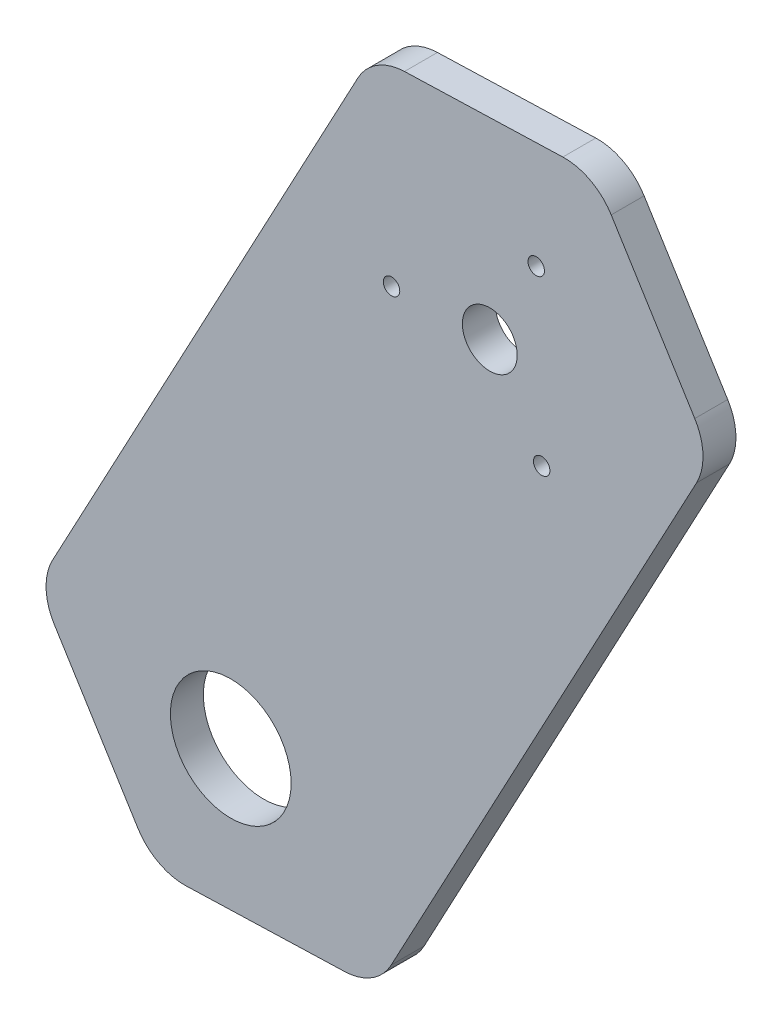
ISO-10303-21;
HEADER;
FILE_DESCRIPTION(('STEP AP214'),'2;1');
FILE_NAME('part.step','',(''),(''),'','','');
FILE_SCHEMA(('AUTOMOTIVE_DESIGN { 1 0 10303 214 1 1 1 1 }'));
ENDSEC;
DATA;
#1=APPLICATION_CONTEXT('core data for automotive mechanical design processes');
#2=APPLICATION_PROTOCOL_DEFINITION('international standard','automotive_design',2000,#1);
#3=PRODUCT_CONTEXT('',#1,'mechanical');
#4=PRODUCT('Part','Part','',(#3));
#5=PRODUCT_RELATED_PRODUCT_CATEGORY('part','',(#4));
#6=PRODUCT_DEFINITION_FORMATION('','',#4);
#7=PRODUCT_DEFINITION_CONTEXT('part definition',#1,'design');
#8=PRODUCT_DEFINITION('design','',#6,#7);
#9=PRODUCT_DEFINITION_SHAPE('','',#8);
#10=(LENGTH_UNIT() NAMED_UNIT(*) SI_UNIT(.MILLI.,.METRE.));
#11=(NAMED_UNIT(*) PLANE_ANGLE_UNIT() SI_UNIT($,.RADIAN.));
#12=(NAMED_UNIT(*) SI_UNIT($,.STERADIAN.) SOLID_ANGLE_UNIT());
#13=UNCERTAINTY_MEASURE_WITH_UNIT(LENGTH_MEASURE(1.E-05),#10,'distance_accuracy_value','');
#14=(GEOMETRIC_REPRESENTATION_CONTEXT(3) GLOBAL_UNCERTAINTY_ASSIGNED_CONTEXT((#13)) GLOBAL_UNIT_ASSIGNED_CONTEXT((#10,
#11,#12)) REPRESENTATION_CONTEXT('',''));
#15=CARTESIAN_POINT('',(0.,0.,0.));
#16=DIRECTION('',(0.,0.,1.));
#17=DIRECTION('',(1.,0.,0.));
#18=AXIS2_PLACEMENT_3D('',#15,#16,#17);
#19=CARTESIAN_POINT('',(-22.5555482322881,278.786500537117,6.));
#20=DIRECTION('',(0.,0.,1.));
#21=DIRECTION('',(1.,0.,0.));
#22=AXIS2_PLACEMENT_3D('',#19,#20,#21);
#23=PLANE('',#22);
#24=CARTESIAN_POINT('',(48.3080319671875,358.170976554401,6.));
#25=DIRECTION('',(0.,0.,1.));
#26=DIRECTION('',(1.,0.,0.));
#27=AXIS2_PLACEMENT_3D('',#24,#25,#26);
#28=CIRCLE('',#27,4.99999999999982);
#29=CARTESIAN_POINT('',(53.3080319671873,358.170976554401,6.));
#30=VERTEX_POINT('',#29);
#31=EDGE_CURVE('E303',#30,#30,#28,.T.);
#32=ORIENTED_EDGE('',*,*,#31,.F.);
#33=EDGE_LOOP('',(#32));
#34=FACE_BOUND('',#33,.T.);
#35=CARTESIAN_POINT('',(57.7585097588791,342.948926532382,6.));
#36=DIRECTION('',(0.,0.,1.));
#37=DIRECTION('',(1.,0.,0.));
#38=AXIS2_PLACEMENT_3D('',#35,#36,#37);
#39=CIRCLE('',#38,1.50000000001931);
#40=CARTESIAN_POINT('',(59.2585097588984,342.948926532382,6.));
#41=VERTEX_POINT('',#40);
#42=EDGE_CURVE('E315',#41,#41,#39,.T.);
#43=ORIENTED_EDGE('',*,*,#42,.F.);
#44=EDGE_LOOP('',(#43));
#45=FACE_BOUND('',#44,.T.);
#46=CARTESIAN_POINT('',(-22.5555482322881,278.786500537117,6.));
#47=DIRECTION('',(0.,0.,1.));
#48=DIRECTION('',(1.,0.,0.));
#49=AXIS2_PLACEMENT_3D('',#46,#47,#48);
#50=CIRCLE('',#49,10.0000000000106);
#51=CARTESIAN_POINT('',(-31.3713622752377,283.50682073392,6.));
#52=VERTEX_POINT('',#51);
#53=CARTESIAN_POINT('',(-31.0513724581903,273.511941719284,6.));
#54=VERTEX_POINT('',#53);
#55=EDGE_CURVE('E185',#52,#54,#50,.T.);
#56=ORIENTED_EDGE('',*,*,#55,.T.);
#57=DIRECTION('',(0.5274558817828,-0.849582422589314,0.));
#58=VECTOR('',#57,1.);
#59=CARTESIAN_POINT('',(-15.8250326915421,248.986609700247,6.));
#60=LINE('',#59,#58);
#61=CARTESIAN_POINT('',(-15.8250326915421,248.986609700247,6.));
#62=VERTEX_POINT('',#61);
#63=EDGE_CURVE('E113',#54,#62,#60,.T.);
#64=ORIENTED_EDGE('',*,*,#63,.T.);
#65=CARTESIAN_POINT('',(-7.32920846566501,254.261168518065,6.));
#66=DIRECTION('',(0.,0.,1.));
#67=DIRECTION('',(1.,0.,0.));
#68=AXIS2_PLACEMENT_3D('',#65,#66,#67);
#69=CIRCLE('',#68,9.99999999998109);
#70=CARTESIAN_POINT('',(-7.00921864860938,244.266289503459,6.));
#71=VERTEX_POINT('',#70);
#72=EDGE_CURVE('E212',#62,#71,#69,.T.);
#73=ORIENTED_EDGE('',*,*,#72,.T.);
#74=DIRECTION('',(0.999487901462477,0.0319989817046271,0.));
#75=VECTOR('',#74,1.);
#76=CARTESIAN_POINT('',(21.8435117994487,245.190020538507,6.));
#77=LINE('',#76,#75);
#78=CARTESIAN_POINT('',(21.8435117994487,245.190020538507,6.));
#79=VERTEX_POINT('',#78);
#80=EDGE_CURVE('E231',#71,#79,#77,.T.);
#81=ORIENTED_EDGE('',*,*,#80,.T.);
#82=CARTESIAN_POINT('',(21.5235219824024,255.184899553132,6.));
#83=DIRECTION('',(0.,0.,1.));
#84=DIRECTION('',(1.,0.,0.));
#85=AXIS2_PLACEMENT_3D('',#82,#83,#84);
#86=CIRCLE('',#85,9.99999999999995);
#87=CARTESIAN_POINT('',(30.3393360253425,250.464579356334,6.));
#88=VERTEX_POINT('',#87);
#89=EDGE_CURVE('E228',#79,#88,#86,.T.);
#90=ORIENTED_EDGE('',*,*,#89,.T.);
#91=DIRECTION('',(0.472032019679815,0.881581404294008,0.));
#92=VECTOR('',#91,1.);
#93=CARTESIAN_POINT('',(85.9765764582599,354.374387392588,6.));
#94=LINE('',#93,#92);
#95=CARTESIAN_POINT('',(85.9765764582599,354.374387392588,6.));
#96=VERTEX_POINT('',#95);
#97=EDGE_CURVE('E230',#88,#96,#94,.T.);
#98=ORIENTED_EDGE('',*,*,#97,.T.);
#99=CARTESIAN_POINT('',(77.1607624153199,359.094707589386,6.));
#100=DIRECTION('',(0.,0.,1.));
#101=DIRECTION('',(1.,0.,0.));
#102=AXIS2_PLACEMENT_3D('',#99,#100,#101);
#103=CIRCLE('',#102,9.99999999999997);
#104=CARTESIAN_POINT('',(85.6565866412138,364.369266407213,6.));
#105=VERTEX_POINT('',#104);
#106=EDGE_CURVE('E233',#96,#105,#103,.T.);
#107=ORIENTED_EDGE('',*,*,#106,.T.);
#108=DIRECTION('',(-0.527455881782663,0.8495824225894,0.));
#109=VECTOR('',#108,1.);
#110=CARTESIAN_POINT('',(70.4302468745695,388.894598426252,6.));
#111=LINE('',#110,#109);
#112=CARTESIAN_POINT('',(70.4302468745695,388.894598426252,6.));
#113=VERTEX_POINT('',#112);
#114=EDGE_CURVE('E239',#105,#113,#111,.T.);
#115=ORIENTED_EDGE('',*,*,#114,.T.);
#116=CARTESIAN_POINT('',(61.9344226486755,383.620039608425,6.));
#117=DIRECTION('',(0.,0.,1.));
#118=DIRECTION('',(1.,0.,0.));
#119=AXIS2_PLACEMENT_3D('',#116,#117,#118);
#120=CIRCLE('',#119,9.99999999999998);
#121=CARTESIAN_POINT('',(61.6144328316293,393.61491862305,6.));
#122=VERTEX_POINT('',#121);
#123=EDGE_CURVE('E144',#113,#122,#120,.T.);
#124=ORIENTED_EDGE('',*,*,#123,.T.);
#125=DIRECTION('',(-0.999487901462478,-0.0319989817046192,0.));
#126=VECTOR('',#125,1.);
#127=CARTESIAN_POINT('',(32.7617023835711,392.691187588002,6.));
#128=LINE('',#127,#126);
#129=CARTESIAN_POINT('',(32.7617023835711,392.691187588002,6.));
#130=VERTEX_POINT('',#129);
#131=EDGE_CURVE('E138',#122,#130,#128,.T.);
#132=ORIENTED_EDGE('',*,*,#131,.T.);
#133=CARTESIAN_POINT('',(33.0816922006173,382.696308573377,6.));
#134=DIRECTION('',(0.,0.,1.));
#135=DIRECTION('',(1.,0.,0.));
#136=AXIS2_PLACEMENT_3D('',#133,#134,#135);
#137=CIRCLE('',#136,9.99999999999998);
#138=CARTESIAN_POINT('',(24.2658781576771,387.416628770175,6.));
#139=VERTEX_POINT('',#138);
#140=EDGE_CURVE('E142',#130,#139,#137,.T.);
#141=ORIENTED_EDGE('',*,*,#140,.T.);
#142=DIRECTION('',(-0.472032019679793,-0.88158140429402,0.));
#143=VECTOR('',#142,1.);
#144=CARTESIAN_POINT('',(-31.3713622752377,283.50682073392,6.));
#145=LINE('',#144,#143);
#146=EDGE_CURVE('E58',#139,#52,#145,.T.);
#147=ORIENTED_EDGE('',*,*,#146,.T.);
#148=EDGE_LOOP('',(#56,#64,#73,#81,#90,#98,#107,#115,#124,#132,#141,#147));
#149=FACE_BOUND('',#148,.T.);
#150=CARTESIAN_POINT('',(56.7654750880705,373.966355410875,6.));
#151=DIRECTION('',(0.,0.,1.));
#152=DIRECTION('',(1.,0.,0.));
#153=AXIS2_PLACEMENT_3D('',#150,#151,#152);
#154=CIRCLE('',#153,1.49999999999305);
#155=CARTESIAN_POINT('',(58.2654750880636,373.966355410875,6.));
#156=VERTEX_POINT('',#155);
#157=EDGE_CURVE('E166',#156,#156,#154,.T.);
#158=ORIENTED_EDGE('',*,*,#157,.F.);
#159=EDGE_LOOP('',(#158));
#160=FACE_BOUND('',#159,.T.);
#161=CARTESIAN_POINT('',(30.4001110546225,357.597647719868,6.));
#162=DIRECTION('',(0.,0.,1.));
#163=DIRECTION('',(1.,0.,0.));
#164=AXIS2_PLACEMENT_3D('',#161,#162,#163);
#165=CIRCLE('',#164,1.49999999999999);
#166=CARTESIAN_POINT('',(31.9001110546225,357.597647719868,6.));
#167=VERTEX_POINT('',#166);
#168=EDGE_CURVE('E309',#167,#167,#165,.T.);
#169=ORIENTED_EDGE('',*,*,#168,.F.);
#170=EDGE_LOOP('',(#169));
#171=FACE_BOUND('',#170,.T.);
#172=CARTESIAN_POINT('',(1.10482999928369,270.012836124959,6.));
#173=DIRECTION('',(0.,0.,1.));
#174=DIRECTION('',(1.,0.,0.));
#175=AXIS2_PLACEMENT_3D('',#172,#173,#174);
#176=CIRCLE('',#175,10.9999999999999);
#177=CARTESIAN_POINT('',(12.1048299992836,270.012836124959,6.));
#178=VERTEX_POINT('',#177);
#179=EDGE_CURVE('E294',#178,#178,#176,.T.);
#180=ORIENTED_EDGE('',*,*,#179,.F.);
#181=EDGE_LOOP('',(#180));
#182=FACE_BOUND('',#181,.T.);
#183=ADVANCED_FACE('F41',(#34,#45,#149,#160,#171,#182),#23,.T.);
#184=CARTESIAN_POINT('',(-22.5555482322881,278.786500537117,0.));
#185=DIRECTION('',(0.,0.,1.));
#186=DIRECTION('',(1.,0.,0.));
#187=AXIS2_PLACEMENT_3D('',#184,#185,#186);
#188=PLANE('',#187);
#189=CARTESIAN_POINT('',(-22.5555482322881,278.786500537117,0.));
#190=DIRECTION('',(0.,0.,1.));
#191=DIRECTION('',(1.,0.,0.));
#192=AXIS2_PLACEMENT_3D('',#189,#190,#191);
#193=CIRCLE('',#192,10.0000000000106);
#194=CARTESIAN_POINT('',(-31.3713622752377,283.50682073392,0.));
#195=VERTEX_POINT('',#194);
#196=CARTESIAN_POINT('',(-31.0513724581903,273.511941719284,0.));
#197=VERTEX_POINT('',#196);
#198=EDGE_CURVE('E162',#195,#197,#193,.T.);
#199=ORIENTED_EDGE('',*,*,#198,.F.);
#200=DIRECTION('',(-0.472032019679793,-0.88158140429402,0.));
#201=VECTOR('',#200,1.);
#202=CARTESIAN_POINT('',(-31.3713622752377,283.50682073392,0.));
#203=LINE('',#202,#201);
#204=CARTESIAN_POINT('',(24.2658781576771,387.416628770175,0.));
#205=VERTEX_POINT('',#204);
#206=EDGE_CURVE('E105',#205,#195,#203,.T.);
#207=ORIENTED_EDGE('',*,*,#206,.F.);
#208=CARTESIAN_POINT('',(33.0816922006173,382.696308573377,0.));
#209=DIRECTION('',(0.,0.,1.));
#210=DIRECTION('',(1.,0.,0.));
#211=AXIS2_PLACEMENT_3D('',#208,#209,#210);
#212=CIRCLE('',#211,9.99999999999998);
#213=CARTESIAN_POINT('',(32.7617023835711,392.691187588002,0.));
#214=VERTEX_POINT('',#213);
#215=EDGE_CURVE('E99',#214,#205,#212,.T.);
#216=ORIENTED_EDGE('',*,*,#215,.F.);
#217=DIRECTION('',(-0.999487901462478,-0.0319989817046192,0.));
#218=VECTOR('',#217,1.);
#219=CARTESIAN_POINT('',(32.7617023835711,392.691187588002,0.));
#220=LINE('',#219,#218);
#221=CARTESIAN_POINT('',(61.6144328316293,393.61491862305,0.));
#222=VERTEX_POINT('',#221);
#223=EDGE_CURVE('E152',#222,#214,#220,.T.);
#224=ORIENTED_EDGE('',*,*,#223,.F.);
#225=CARTESIAN_POINT('',(61.9344226486755,383.620039608425,0.));
#226=DIRECTION('',(0.,0.,1.));
#227=DIRECTION('',(1.,0.,0.));
#228=AXIS2_PLACEMENT_3D('',#225,#226,#227);
#229=CIRCLE('',#228,9.99999999999998);
#230=CARTESIAN_POINT('',(70.4302468745695,388.894598426252,0.));
#231=VERTEX_POINT('',#230);
#232=EDGE_CURVE('E180',#231,#222,#229,.T.);
#233=ORIENTED_EDGE('',*,*,#232,.F.);
#234=DIRECTION('',(-0.527455881782663,0.8495824225894,0.));
#235=VECTOR('',#234,1.);
#236=CARTESIAN_POINT('',(70.4302468745695,388.894598426252,0.));
#237=LINE('',#236,#235);
#238=CARTESIAN_POINT('',(85.6565866412138,364.369266407213,0.));
#239=VERTEX_POINT('',#238);
#240=EDGE_CURVE('E178',#239,#231,#237,.T.);
#241=ORIENTED_EDGE('',*,*,#240,.F.);
#242=CARTESIAN_POINT('',(77.1607624153199,359.094707589386,0.));
#243=DIRECTION('',(0.,0.,1.));
#244=DIRECTION('',(1.,0.,0.));
#245=AXIS2_PLACEMENT_3D('',#242,#243,#244);
#246=CIRCLE('',#245,9.99999999999997);
#247=CARTESIAN_POINT('',(85.9765764582599,354.374387392588,0.));
#248=VERTEX_POINT('',#247);
#249=EDGE_CURVE('E176',#248,#239,#246,.T.);
#250=ORIENTED_EDGE('',*,*,#249,.F.);
#251=DIRECTION('',(0.472032019679815,0.881581404294008,0.));
#252=VECTOR('',#251,1.);
#253=CARTESIAN_POINT('',(85.9765764582599,354.374387392588,0.));
#254=LINE('',#253,#252);
#255=CARTESIAN_POINT('',(30.3393360253425,250.464579356334,0.));
#256=VERTEX_POINT('',#255);
#257=EDGE_CURVE('E174',#256,#248,#254,.T.);
#258=ORIENTED_EDGE('',*,*,#257,.F.);
#259=CARTESIAN_POINT('',(21.5235219824024,255.184899553132,0.));
#260=DIRECTION('',(0.,0.,1.));
#261=DIRECTION('',(1.,0.,0.));
#262=AXIS2_PLACEMENT_3D('',#259,#260,#261);
#263=CIRCLE('',#262,9.99999999999995);
#264=CARTESIAN_POINT('',(21.8435117994487,245.190020538507,0.));
#265=VERTEX_POINT('',#264);
#266=EDGE_CURVE('E172',#265,#256,#263,.T.);
#267=ORIENTED_EDGE('',*,*,#266,.F.);
#268=DIRECTION('',(0.999487901462477,0.0319989817046271,0.));
#269=VECTOR('',#268,1.);
#270=CARTESIAN_POINT('',(21.8435117994487,245.190020538507,0.));
#271=LINE('',#270,#269);
#272=CARTESIAN_POINT('',(-7.00921864860938,244.266289503459,0.));
#273=VERTEX_POINT('',#272);
#274=EDGE_CURVE('E170',#273,#265,#271,.T.);
#275=ORIENTED_EDGE('',*,*,#274,.F.);
#276=CARTESIAN_POINT('',(-7.32920846566501,254.261168518065,0.));
#277=DIRECTION('',(0.,0.,1.));
#278=DIRECTION('',(1.,0.,0.));
#279=AXIS2_PLACEMENT_3D('',#276,#277,#278);
#280=CIRCLE('',#279,9.99999999998109);
#281=CARTESIAN_POINT('',(-15.8250326915421,248.986609700247,0.));
#282=VERTEX_POINT('',#281);
#283=EDGE_CURVE('E168',#282,#273,#280,.T.);
#284=ORIENTED_EDGE('',*,*,#283,.F.);
#285=DIRECTION('',(0.5274558817828,-0.849582422589314,0.));
#286=VECTOR('',#285,1.);
#287=CARTESIAN_POINT('',(-15.8250326915421,248.986609700247,0.));
#288=LINE('',#287,#286);
#289=EDGE_CURVE('E165',#197,#282,#288,.T.);
#290=ORIENTED_EDGE('',*,*,#289,.F.);
#291=EDGE_LOOP('',(#199,#207,#216,#224,#233,#241,#250,#258,#267,#275,#284,#290));
#292=FACE_BOUND('',#291,.T.);
#293=CARTESIAN_POINT('',(56.7654750880705,373.966355410875,0.));
#294=DIRECTION('',(0.,0.,1.));
#295=DIRECTION('',(1.,0.,0.));
#296=AXIS2_PLACEMENT_3D('',#293,#294,#295);
#297=CIRCLE('',#296,1.49999999999305);
#298=CARTESIAN_POINT('',(58.2654750880636,373.966355410875,0.));
#299=VERTEX_POINT('',#298);
#300=EDGE_CURVE('E318',#299,#299,#297,.T.);
#301=ORIENTED_EDGE('',*,*,#300,.T.);
#302=EDGE_LOOP('',(#301));
#303=FACE_BOUND('',#302,.T.);
#304=CARTESIAN_POINT('',(57.7585097588791,342.948926532382,0.));
#305=DIRECTION('',(0.,0.,1.));
#306=DIRECTION('',(1.,0.,0.));
#307=AXIS2_PLACEMENT_3D('',#304,#305,#306);
#308=CIRCLE('',#307,1.50000000001931);
#309=CARTESIAN_POINT('',(59.2585097588984,342.948926532382,0.));
#310=VERTEX_POINT('',#309);
#311=EDGE_CURVE('E312',#310,#310,#308,.T.);
#312=ORIENTED_EDGE('',*,*,#311,.T.);
#313=EDGE_LOOP('',(#312));
#314=FACE_BOUND('',#313,.T.);
#315=CARTESIAN_POINT('',(30.4001110546225,357.597647719868,0.));
#316=DIRECTION('',(0.,0.,1.));
#317=DIRECTION('',(1.,0.,0.));
#318=AXIS2_PLACEMENT_3D('',#315,#316,#317);
#319=CIRCLE('',#318,1.49999999999999);
#320=CARTESIAN_POINT('',(31.9001110546225,357.597647719868,0.));
#321=VERTEX_POINT('',#320);
#322=EDGE_CURVE('E306',#321,#321,#319,.T.);
#323=ORIENTED_EDGE('',*,*,#322,.T.);
#324=EDGE_LOOP('',(#323));
#325=FACE_BOUND('',#324,.T.);
#326=CARTESIAN_POINT('',(48.3080319671875,358.170976554401,0.));
#327=DIRECTION('',(0.,0.,1.));
#328=DIRECTION('',(1.,0.,0.));
#329=AXIS2_PLACEMENT_3D('',#326,#327,#328);
#330=CIRCLE('',#329,4.99999999999982);
#331=CARTESIAN_POINT('',(53.3080319671873,358.170976554401,0.));
#332=VERTEX_POINT('',#331);
#333=EDGE_CURVE('E300',#332,#332,#330,.T.);
#334=ORIENTED_EDGE('',*,*,#333,.T.);
#335=EDGE_LOOP('',(#334));
#336=FACE_BOUND('',#335,.T.);
#337=CARTESIAN_POINT('',(1.10482999928369,270.012836124959,0.));
#338=DIRECTION('',(0.,0.,1.));
#339=DIRECTION('',(1.,0.,0.));
#340=AXIS2_PLACEMENT_3D('',#337,#338,#339);
#341=CIRCLE('',#340,10.9999999999999);
#342=CARTESIAN_POINT('',(12.1048299992836,270.012836124959,0.));
#343=VERTEX_POINT('',#342);
#344=EDGE_CURVE('E297',#343,#343,#341,.T.);
#345=ORIENTED_EDGE('',*,*,#344,.T.);
#346=EDGE_LOOP('',(#345));
#347=FACE_BOUND('',#346,.T.);
#348=ADVANCED_FACE('F216',(#292,#303,#314,#325,#336,#347),#188,.F.);
#349=CARTESIAN_POINT('',(-22.5555482322881,278.786500537117,6.));
#350=DIRECTION('',(0.,0.,-1.));
#351=DIRECTION('',(-1.,0.,0.));
#352=AXIS2_PLACEMENT_3D('',#349,#350,#351);
#353=CYLINDRICAL_SURFACE('',#352,10.0000000000106);
#354=ORIENTED_EDGE('',*,*,#198,.T.);
#355=DIRECTION('',(0.,0.,-1.));
#356=VECTOR('',#355,1.);
#357=CARTESIAN_POINT('',(-31.0513724581903,273.511941719284,6.));
#358=LINE('',#357,#356);
#359=EDGE_CURVE('E11',#54,#197,#358,.T.);
#360=ORIENTED_EDGE('',*,*,#359,.F.);
#361=ORIENTED_EDGE('',*,*,#55,.F.);
#362=DIRECTION('',(0.,0.,-1.));
#363=VECTOR('',#362,1.);
#364=CARTESIAN_POINT('',(-31.3713622752377,283.50682073392,6.));
#365=LINE('',#364,#363);
#366=EDGE_CURVE('E158',#52,#195,#365,.T.);
#367=ORIENTED_EDGE('',*,*,#366,.T.);
#368=EDGE_LOOP('',(#354,#360,#361,#367));
#369=FACE_BOUND('',#368,.T.);
#370=ADVANCED_FACE('F43',(#369),#353,.T.);
#371=CARTESIAN_POINT('',(-15.8250326915421,248.986609700247,6.));
#372=DIRECTION('',(0.849582422589314,0.5274558817828,0.));
#373=DIRECTION('',(-0.5274558817828,0.849582422589315,0.));
#374=AXIS2_PLACEMENT_3D('',#371,#372,#373);
#375=PLANE('',#374);
#376=ORIENTED_EDGE('',*,*,#289,.T.);
#377=DIRECTION('',(0.,0.,-1.));
#378=VECTOR('',#377,1.);
#379=CARTESIAN_POINT('',(-15.8250326915421,248.986609700247,6.));
#380=LINE('',#379,#378);
#381=EDGE_CURVE('E50',#62,#282,#380,.T.);
#382=ORIENTED_EDGE('',*,*,#381,.F.);
#383=ORIENTED_EDGE('',*,*,#63,.F.);
#384=ORIENTED_EDGE('',*,*,#359,.T.);
#385=EDGE_LOOP('',(#376,#382,#383,#384));
#386=FACE_BOUND('',#385,.T.);
#387=ADVANCED_FACE('F447',(#386),#375,.F.);
#388=CARTESIAN_POINT('',(-7.32920846566501,254.261168518065,6.));
#389=DIRECTION('',(0.,0.,-1.));
#390=DIRECTION('',(-1.,0.,0.));
#391=AXIS2_PLACEMENT_3D('',#388,#389,#390);
#392=CYLINDRICAL_SURFACE('',#391,9.99999999998109);
#393=ORIENTED_EDGE('',*,*,#283,.T.);
#394=DIRECTION('',(0.,0.,-1.));
#395=VECTOR('',#394,1.);
#396=CARTESIAN_POINT('',(-7.00921864860938,244.266289503459,6.));
#397=LINE('',#396,#395);
#398=EDGE_CURVE('E204',#71,#273,#397,.T.);
#399=ORIENTED_EDGE('',*,*,#398,.F.);
#400=ORIENTED_EDGE('',*,*,#72,.F.);
#401=ORIENTED_EDGE('',*,*,#381,.T.);
#402=EDGE_LOOP('',(#393,#399,#400,#401));
#403=FACE_BOUND('',#402,.T.);
#404=ADVANCED_FACE('F210',(#403),#392,.T.);
#405=CARTESIAN_POINT('',(21.8435117994487,245.190020538507,6.));
#406=DIRECTION('',(-0.0319989817046271,0.999487901462477,0.));
#407=DIRECTION('',(-0.999487901462478,-0.0319989817046271,0.));
#408=AXIS2_PLACEMENT_3D('',#405,#406,#407);
#409=PLANE('',#408);
#410=ORIENTED_EDGE('',*,*,#274,.T.);
#411=DIRECTION('',(0.,0.,-1.));
#412=VECTOR('',#411,1.);
#413=CARTESIAN_POINT('',(21.8435117994487,245.190020538507,6.));
#414=LINE('',#413,#412);
#415=EDGE_CURVE('E201',#79,#265,#414,.T.);
#416=ORIENTED_EDGE('',*,*,#415,.F.);
#417=ORIENTED_EDGE('',*,*,#80,.F.);
#418=ORIENTED_EDGE('',*,*,#398,.T.);
#419=EDGE_LOOP('',(#410,#416,#417,#418));
#420=FACE_BOUND('',#419,.T.);
#421=ADVANCED_FACE('F222',(#420),#409,.F.);
#422=CARTESIAN_POINT('',(21.5235219824024,255.184899553132,6.));
#423=DIRECTION('',(0.,0.,-1.));
#424=DIRECTION('',(-1.,0.,0.));
#425=AXIS2_PLACEMENT_3D('',#422,#423,#424);
#426=CYLINDRICAL_SURFACE('',#425,9.99999999999995);
#427=ORIENTED_EDGE('',*,*,#266,.T.);
#428=DIRECTION('',(0.,0.,-1.));
#429=VECTOR('',#428,1.);
#430=CARTESIAN_POINT('',(30.3393360253425,250.464579356334,6.));
#431=LINE('',#430,#429);
#432=EDGE_CURVE('E198',#88,#256,#431,.T.);
#433=ORIENTED_EDGE('',*,*,#432,.F.);
#434=ORIENTED_EDGE('',*,*,#89,.F.);
#435=ORIENTED_EDGE('',*,*,#415,.T.);
#436=EDGE_LOOP('',(#427,#433,#434,#435));
#437=FACE_BOUND('',#436,.T.);
#438=ADVANCED_FACE('F226',(#437),#426,.T.);
#439=CARTESIAN_POINT('',(85.9765764582599,354.374387392588,6.));
#440=DIRECTION('',(-0.881581404294008,0.472032019679815,0.));
#441=DIRECTION('',(-0.472032019679815,-0.881581404294008,0.));
#442=AXIS2_PLACEMENT_3D('',#439,#440,#441);
#443=PLANE('',#442);
#444=ORIENTED_EDGE('',*,*,#257,.T.);
#445=DIRECTION('',(0.,0.,-1.));
#446=VECTOR('',#445,1.);
#447=CARTESIAN_POINT('',(85.9765764582599,354.374387392588,6.));
#448=LINE('',#447,#446);
#449=EDGE_CURVE('E195',#96,#248,#448,.T.);
#450=ORIENTED_EDGE('',*,*,#449,.F.);
#451=ORIENTED_EDGE('',*,*,#97,.F.);
#452=ORIENTED_EDGE('',*,*,#432,.T.);
#453=EDGE_LOOP('',(#444,#450,#451,#452));
#454=FACE_BOUND('',#453,.T.);
#455=ADVANCED_FACE('F408',(#454),#443,.F.);
#456=CARTESIAN_POINT('',(77.1607624153199,359.094707589386,6.));
#457=DIRECTION('',(0.,0.,-1.));
#458=DIRECTION('',(-1.,0.,0.));
#459=AXIS2_PLACEMENT_3D('',#456,#457,#458);
#460=CYLINDRICAL_SURFACE('',#459,9.99999999999997);
#461=ORIENTED_EDGE('',*,*,#249,.T.);
#462=DIRECTION('',(0.,0.,-1.));
#463=VECTOR('',#462,1.);
#464=CARTESIAN_POINT('',(85.6565866412138,364.369266407213,6.));
#465=LINE('',#464,#463);
#466=EDGE_CURVE('E192',#105,#239,#465,.T.);
#467=ORIENTED_EDGE('',*,*,#466,.F.);
#468=ORIENTED_EDGE('',*,*,#106,.F.);
#469=ORIENTED_EDGE('',*,*,#449,.T.);
#470=EDGE_LOOP('',(#461,#467,#468,#469));
#471=FACE_BOUND('',#470,.T.);
#472=ADVANCED_FACE('F398',(#471),#460,.T.);
#473=CARTESIAN_POINT('',(70.4302468745695,388.894598426252,6.));
#474=DIRECTION('',(-0.8495824225894,-0.527455881782663,0.));
#475=DIRECTION('',(0.527455881782663,-0.8495824225894,0.));
#476=AXIS2_PLACEMENT_3D('',#473,#474,#475);
#477=PLANE('',#476);
#478=ORIENTED_EDGE('',*,*,#240,.T.);
#479=DIRECTION('',(0.,0.,-1.));
#480=VECTOR('',#479,1.);
#481=CARTESIAN_POINT('',(70.4302468745695,388.894598426252,6.));
#482=LINE('',#481,#480);
#483=EDGE_CURVE('E189',#113,#231,#482,.T.);
#484=ORIENTED_EDGE('',*,*,#483,.F.);
#485=ORIENTED_EDGE('',*,*,#114,.F.);
#486=ORIENTED_EDGE('',*,*,#466,.T.);
#487=EDGE_LOOP('',(#478,#484,#485,#486));
#488=FACE_BOUND('',#487,.T.);
#489=ADVANCED_FACE('F245',(#488),#477,.F.);
#490=CARTESIAN_POINT('',(61.9344226486755,383.620039608425,6.));
#491=DIRECTION('',(0.,0.,-1.));
#492=DIRECTION('',(-1.,0.,0.));
#493=AXIS2_PLACEMENT_3D('',#490,#491,#492);
#494=CYLINDRICAL_SURFACE('',#493,9.99999999999998);
#495=ORIENTED_EDGE('',*,*,#232,.T.);
#496=DIRECTION('',(0.,0.,-1.));
#497=VECTOR('',#496,1.);
#498=CARTESIAN_POINT('',(61.6144328316293,393.61491862305,6.));
#499=LINE('',#498,#497);
#500=EDGE_CURVE('E153',#122,#222,#499,.T.);
#501=ORIENTED_EDGE('',*,*,#500,.F.);
#502=ORIENTED_EDGE('',*,*,#123,.F.);
#503=ORIENTED_EDGE('',*,*,#483,.T.);
#504=EDGE_LOOP('',(#495,#501,#502,#503));
#505=FACE_BOUND('',#504,.T.);
#506=ADVANCED_FACE('F249',(#505),#494,.T.);
#507=CARTESIAN_POINT('',(32.7617023835711,392.691187588002,6.));
#508=DIRECTION('',(0.0319989817046192,-0.999487901462478,0.));
#509=DIRECTION('',(0.999487901462478,0.0319989817046192,0.));
#510=AXIS2_PLACEMENT_3D('',#507,#508,#509);
#511=PLANE('',#510);
#512=ORIENTED_EDGE('',*,*,#223,.T.);
#513=DIRECTION('',(0.,0.,-1.));
#514=VECTOR('',#513,1.);
#515=CARTESIAN_POINT('',(32.7617023835711,392.691187588002,6.));
#516=LINE('',#515,#514);
#517=EDGE_CURVE('E149',#130,#214,#516,.T.);
#518=ORIENTED_EDGE('',*,*,#517,.F.);
#519=ORIENTED_EDGE('',*,*,#131,.F.);
#520=ORIENTED_EDGE('',*,*,#500,.T.);
#521=EDGE_LOOP('',(#512,#518,#519,#520));
#522=FACE_BOUND('',#521,.T.);
#523=ADVANCED_FACE('F150',(#522),#511,.F.);
#524=CARTESIAN_POINT('',(33.0816922006173,382.696308573377,6.));
#525=DIRECTION('',(0.,0.,-1.));
#526=DIRECTION('',(-1.,0.,0.));
#527=AXIS2_PLACEMENT_3D('',#524,#525,#526);
#528=CYLINDRICAL_SURFACE('',#527,9.99999999999998);
#529=ORIENTED_EDGE('',*,*,#215,.T.);
#530=DIRECTION('',(0.,0.,-1.));
#531=VECTOR('',#530,1.);
#532=CARTESIAN_POINT('',(24.2658781576771,387.416628770175,6.));
#533=LINE('',#532,#531);
#534=EDGE_CURVE('E154',#139,#205,#533,.T.);
#535=ORIENTED_EDGE('',*,*,#534,.F.);
#536=ORIENTED_EDGE('',*,*,#140,.F.);
#537=ORIENTED_EDGE('',*,*,#517,.T.);
#538=EDGE_LOOP('',(#529,#535,#536,#537));
#539=FACE_BOUND('',#538,.T.);
#540=ADVANCED_FACE('F156',(#539),#528,.T.);
#541=CARTESIAN_POINT('',(-31.3713622752377,283.50682073392,6.));
#542=DIRECTION('',(0.881581404294019,-0.472032019679793,0.));
#543=DIRECTION('',(0.472032019679793,0.88158140429402,0.));
#544=AXIS2_PLACEMENT_3D('',#541,#542,#543);
#545=PLANE('',#544);
#546=ORIENTED_EDGE('',*,*,#206,.T.);
#547=ORIENTED_EDGE('',*,*,#366,.F.);
#548=ORIENTED_EDGE('',*,*,#146,.F.);
#549=ORIENTED_EDGE('',*,*,#534,.T.);
#550=EDGE_LOOP('',(#546,#547,#548,#549));
#551=FACE_BOUND('',#550,.T.);
#552=ADVANCED_FACE('F253',(#551),#545,.F.);
#553=CARTESIAN_POINT('',(56.7654750880705,373.966355410875,6.));
#554=DIRECTION('',(0.,0.,-1.));
#555=DIRECTION('',(-1.,0.,0.));
#556=AXIS2_PLACEMENT_3D('',#553,#554,#555);
#557=CYLINDRICAL_SURFACE('',#556,1.49999999999305);
#558=ORIENTED_EDGE('',*,*,#157,.T.);
#559=EDGE_LOOP('',(#558));
#560=FACE_BOUND('',#559,.T.);
#561=ORIENTED_EDGE('',*,*,#300,.F.);
#562=EDGE_LOOP('',(#561));
#563=FACE_BOUND('',#562,.T.);
#564=ADVANCED_FACE('F255',(#560,#563),#557,.F.);
#565=CARTESIAN_POINT('',(57.7585097588791,342.948926532382,6.));
#566=DIRECTION('',(0.,0.,-1.));
#567=DIRECTION('',(-1.,0.,0.));
#568=AXIS2_PLACEMENT_3D('',#565,#566,#567);
#569=CYLINDRICAL_SURFACE('',#568,1.50000000001931);
#570=ORIENTED_EDGE('',*,*,#42,.T.);
#571=EDGE_LOOP('',(#570));
#572=FACE_BOUND('',#571,.T.);
#573=ORIENTED_EDGE('',*,*,#311,.F.);
#574=EDGE_LOOP('',(#573));
#575=FACE_BOUND('',#574,.T.);
#576=ADVANCED_FACE('F261',(#572,#575),#569,.F.);
#577=CARTESIAN_POINT('',(30.4001110546225,357.597647719868,6.));
#578=DIRECTION('',(0.,0.,-1.));
#579=DIRECTION('',(-1.,0.,0.));
#580=AXIS2_PLACEMENT_3D('',#577,#578,#579);
#581=CYLINDRICAL_SURFACE('',#580,1.49999999999999);
#582=ORIENTED_EDGE('',*,*,#168,.T.);
#583=EDGE_LOOP('',(#582));
#584=FACE_BOUND('',#583,.T.);
#585=ORIENTED_EDGE('',*,*,#322,.F.);
#586=EDGE_LOOP('',(#585));
#587=FACE_BOUND('',#586,.T.);
#588=ADVANCED_FACE('F277',(#584,#587),#581,.F.);
#589=CARTESIAN_POINT('',(48.3080319671875,358.170976554401,6.));
#590=DIRECTION('',(0.,0.,-1.));
#591=DIRECTION('',(-1.,0.,0.));
#592=AXIS2_PLACEMENT_3D('',#589,#590,#591);
#593=CYLINDRICAL_SURFACE('',#592,4.99999999999982);
#594=ORIENTED_EDGE('',*,*,#31,.T.);
#595=EDGE_LOOP('',(#594));
#596=FACE_BOUND('',#595,.T.);
#597=ORIENTED_EDGE('',*,*,#333,.F.);
#598=EDGE_LOOP('',(#597));
#599=FACE_BOUND('',#598,.T.);
#600=ADVANCED_FACE('F281',(#596,#599),#593,.F.);
#601=CARTESIAN_POINT('',(1.10482999928369,270.012836124959,6.));
#602=DIRECTION('',(0.,0.,-1.));
#603=DIRECTION('',(-1.,0.,0.));
#604=AXIS2_PLACEMENT_3D('',#601,#602,#603);
#605=CYLINDRICAL_SURFACE('',#604,10.9999999999999);
#606=ORIENTED_EDGE('',*,*,#179,.T.);
#607=EDGE_LOOP('',(#606));
#608=FACE_BOUND('',#607,.T.);
#609=ORIENTED_EDGE('',*,*,#344,.F.);
#610=EDGE_LOOP('',(#609));
#611=FACE_BOUND('',#610,.T.);
#612=ADVANCED_FACE('F285',(#608,#611),#605,.F.);
#613=CLOSED_SHELL('',(#183,#348,#370,#387,#404,#421,#438,#455,#472,#489,#506,#523,#540,#552,
#564,#576,#588,#600,#612));
#614=MANIFOLD_SOLID_BREP('B2',#613);
#615=ADVANCED_BREP_SHAPE_REPRESENTATION('',(#18,#614),#14);
#616=SHAPE_DEFINITION_REPRESENTATION(#9,#615);
ENDSEC;
END-ISO-10303-21;
